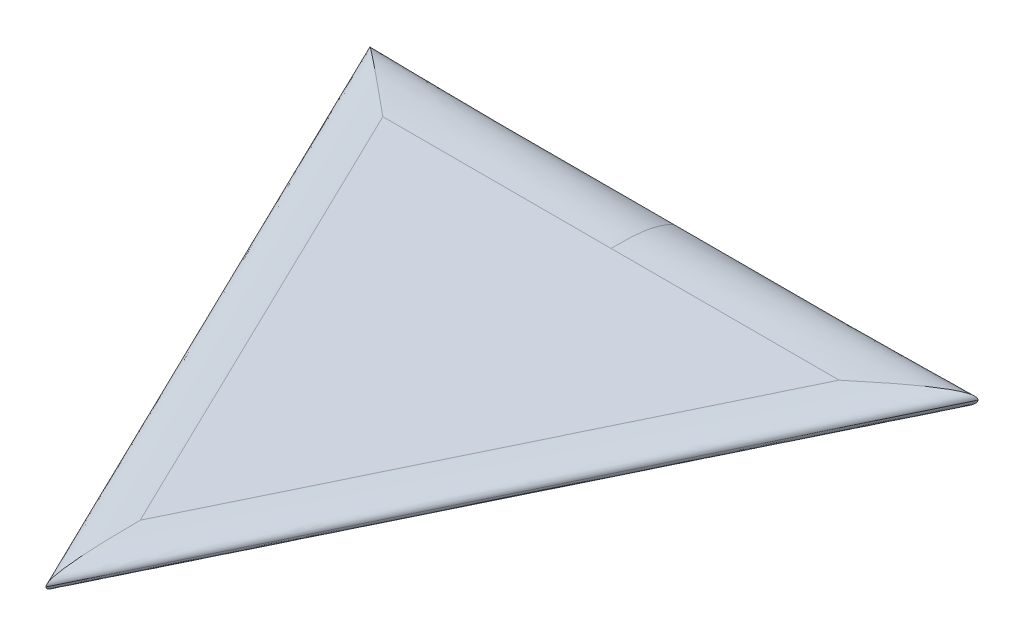
ISO-10303-21;
HEADER;
FILE_DESCRIPTION(('STEP AP214'),'2;1');
FILE_NAME('part.step','',(''),(''),'','','');
FILE_SCHEMA(('AUTOMOTIVE_DESIGN { 1 0 10303 214 1 1 1 1 }'));
ENDSEC;
DATA;
#1=APPLICATION_CONTEXT('core data for automotive mechanical design processes');
#2=APPLICATION_PROTOCOL_DEFINITION('international standard','automotive_design',2000,#1);
#3=PRODUCT_CONTEXT('',#1,'mechanical');
#4=PRODUCT('Part','Part','',(#3));
#5=PRODUCT_RELATED_PRODUCT_CATEGORY('part','',(#4));
#6=PRODUCT_DEFINITION_FORMATION('','',#4);
#7=PRODUCT_DEFINITION_CONTEXT('part definition',#1,'design');
#8=PRODUCT_DEFINITION('design','',#6,#7);
#9=PRODUCT_DEFINITION_SHAPE('','',#8);
#10=(LENGTH_UNIT() NAMED_UNIT(*) SI_UNIT(.MILLI.,.METRE.));
#11=(NAMED_UNIT(*) PLANE_ANGLE_UNIT() SI_UNIT($,.RADIAN.));
#12=(NAMED_UNIT(*) SI_UNIT($,.STERADIAN.) SOLID_ANGLE_UNIT());
#13=UNCERTAINTY_MEASURE_WITH_UNIT(LENGTH_MEASURE(1.E-05),#10,'distance_accuracy_value','');
#14=(GEOMETRIC_REPRESENTATION_CONTEXT(3) GLOBAL_UNCERTAINTY_ASSIGNED_CONTEXT((#13)) GLOBAL_UNIT_ASSIGNED_CONTEXT((#10,
#11,#12)) REPRESENTATION_CONTEXT('',''));
#15=CARTESIAN_POINT('',(0.,0.,0.));
#16=DIRECTION('',(0.,0.,1.));
#17=DIRECTION('',(1.,0.,0.));
#18=AXIS2_PLACEMENT_3D('',#15,#16,#17);
#19=CARTESIAN_POINT('',(0.,1.70008,0.));
#20=DIRECTION('',(0.,-1.,0.));
#21=DIRECTION('',(0.,0.,-1.));
#22=AXIS2_PLACEMENT_3D('',#19,#20,#21);
#23=PLANE('',#22);
#24=DIRECTION('',(1.,0.,0.));
#25=VECTOR('',#24,1.);
#26=CARTESIAN_POINT('',(18.1702141807132,1.70008,-90.));
#27=LINE('',#26,#25);
#28=CARTESIAN_POINT('',(0.,1.70008,-90.));
#29=VERTEX_POINT('',#28);
#30=CARTESIAN_POINT('',(36.3404283614264,1.70008,-90.));
#31=VERTEX_POINT('',#30);
#32=EDGE_CURVE('E122',#29,#31,#27,.T.);
#33=ORIENTED_EDGE('',*,*,#32,.F.);
#34=DIRECTION('',(-1.,0.,0.));
#35=VECTOR('',#34,1.);
#36=CARTESIAN_POINT('',(-18.1702141807132,1.70008,-90.));
#37=LINE('',#36,#35);
#38=CARTESIAN_POINT('',(-36.3404283614264,1.70008,-90.));
#39=VERTEX_POINT('',#38);
#40=EDGE_CURVE('E521',#29,#39,#37,.T.);
#41=ORIENTED_EDGE('',*,*,#40,.T.);
#42=DIRECTION('',(0.436048023411072,0.,0.899923397450748));
#43=VECTOR('',#42,1.);
#44=CARTESIAN_POINT('',(-18.1702141807132,1.70008,-52.5));
#45=LINE('',#44,#43);
#46=CARTESIAN_POINT('',(0.,1.70008,-15.));
#47=VERTEX_POINT('',#46);
#48=EDGE_CURVE('E134',#39,#47,#45,.T.);
#49=ORIENTED_EDGE('',*,*,#48,.T.);
#50=DIRECTION('',(-0.436048023411072,0.,0.899923397450748));
#51=VECTOR('',#50,1.);
#52=CARTESIAN_POINT('',(18.1702141807132,1.70008,-52.5));
#53=LINE('',#52,#51);
#54=EDGE_CURVE('E129',#31,#47,#53,.T.);
#55=ORIENTED_EDGE('',*,*,#54,.F.);
#56=EDGE_LOOP('',(#33,#41,#49,#55));
#57=FACE_BOUND('',#56,.T.);
#58=ADVANCED_FACE('F113',(#57),#23,.F.);
#59=CARTESIAN_POINT('',(0.,1.70008,-15.));
#60=CARTESIAN_POINT('',(12.1134761204755,1.70008,-40.));
#61=CARTESIAN_POINT('',(24.226952240951,1.70008,-65.));
#62=CARTESIAN_POINT('',(36.3404283614264,1.70008,-90.));
#63=CARTESIAN_POINT('',(0.,1.70008,-14.7483994170613));
#64=CARTESIAN_POINT('',(12.1778442477488,1.70008,-39.8862021542223));
#65=CARTESIAN_POINT('',(24.3630565973957,1.70008,-65.0241128715533));
#66=CARTESIAN_POINT('',(36.5434986665467,1.70008,-90.1676399929307));
#67=CARTESIAN_POINT('',(0.,1.70008,-9.71638775828661));
#68=CARTESIAN_POINT('',(13.4718507420828,1.70008,-37.6141334815913));
#69=CARTESIAN_POINT('',(27.0836954202283,1.70008,-65.5139308281273));
#70=CARTESIAN_POINT('',(40.6049047689522,1.70008,-93.5204398515447));
#71=CARTESIAN_POINT('',(0.,1.44840525822499,0.));
#72=CARTESIAN_POINT('',(16.1513014939673,1.52711668709418,-33.3333333333334));
#73=CARTESIAN_POINT('',(32.3026029879346,1.60582811596337,-66.6666666666667));
#74=CARTESIAN_POINT('',(48.4539044819019,1.68453954483256,-100.));
#75=CARTESIAN_POINT('',(0.,0.,0.));
#76=CARTESIAN_POINT('',(16.1513014939673,0.,-33.3333333333333));
#77=CARTESIAN_POINT('',(32.3026029879346,0.,-66.6666666666667));
#78=CARTESIAN_POINT('',(48.4539044819019,0.,-100.));
#79=B_SPLINE_SURFACE_WITH_KNOTS('',3,3,((#59,#60,#61,#62),(#63,#64,#65,#66),(#67,#68,#69,#70),
(#71,#72,#73,#74),(#75,#76,#77,#78)),.UNSPECIFIED.,.F.,.F.,.F.,(4,1,4),(4,4),(0.,
0.0500000000000003,1.),(0.,1.),.UNSPECIFIED.);
#80=CARTESIAN_POINT('',(0.,1.70008,-15.));
#81=CARTESIAN_POINT('',(0.,1.70008,-14.7483994170613));
#82=CARTESIAN_POINT('',(0.,1.70008,-9.71638775828661));
#83=CARTESIAN_POINT('',(0.,1.44840525822499,0.));
#84=CARTESIAN_POINT('',(0.,0.,0.));
#85=B_SPLINE_CURVE_WITH_KNOTS('',3,(#80,#81,#82,#83,#84),.UNSPECIFIED.,.F.,.F.,(4,1,4),(0.,
0.0500000000000003,1.),.UNSPECIFIED.);
#86=CARTESIAN_POINT('',(0.,0.,0.));
#87=VERTEX_POINT('',#86);
#88=EDGE_CURVE('E384',#47,#87,#85,.T.);
#89=DIRECTION('',(0.436048023411072,0.,-0.899923397450748));
#90=VECTOR('',#89,1.);
#91=CARTESIAN_POINT('',(0.,0.,0.));
#92=LINE('',#91,#90);
#93=CARTESIAN_POINT('',(48.4539044819019,0.,-100.));
#94=VERTEX_POINT('',#93);
#95=EDGE_CURVE('E342',#87,#94,#92,.T.);
#96=CARTESIAN_POINT('',(36.3404283614264,1.70008,-90.));
#97=CARTESIAN_POINT('',(37.3557798870278,1.70008,-90.8381999646535));
#98=CARTESIAN_POINT('',(39.7613131676455,1.70694788147637,-92.8240323192092));
#99=CARTESIAN_POINT('',(43.9713074780562,1.56901335403724,-96.2994957357709));
#100=CARTESIAN_POINT('',(47.4171355480387,1.09855531385303,-99.1441193893875));
#101=CARTESIAN_POINT('',(48.4539044819019,0.443299880219094,-100.));
#102=CARTESIAN_POINT('',(48.4539044819019,0.,-100.));
#103=B_SPLINE_CURVE_WITH_KNOTS('',3,(#96,#97,#98,#99,#100,#101,#102),.UNSPECIFIED.,.F.,.F.,(4,1,
1,1,4),(0.,0.25,0.5,0.75,1.),.UNSPECIFIED.);
#104=EDGE_CURVE('E13',#31,#94,#103,.T.);
#105=ORIENTED_EDGE('',*,*,#88,.T.);
#106=ORIENTED_EDGE('',*,*,#95,.T.);
#107=ORIENTED_EDGE('',*,*,#104,.F.);
#108=ORIENTED_EDGE('',*,*,#54,.T.);
#109=EDGE_LOOP('',(#105,#106,#107,#108));
#110=FACE_BOUND('',#109,.T.);
#111=ADVANCED_FACE('F308',(#110),#79,.T.);
#112=CARTESIAN_POINT('',(36.3404283614264,1.70008,-90.));
#113=CARTESIAN_POINT('',(24.2269522409509,1.70008,-90.));
#114=CARTESIAN_POINT('',(12.1134761204755,1.70008,-90.));
#115=CARTESIAN_POINT('',(0.,1.70008,-90.));
#116=CARTESIAN_POINT('',(37.3557798870278,1.70008,-90.8381999646535));
#117=CARTESIAN_POINT('',(24.9038532580185,1.70008,-90.8405634268338));
#118=CARTESIAN_POINT('',(12.4519266290093,1.70008,-90.8429268890141));
#119=CARTESIAN_POINT('',(0.,1.70008,-90.8452903511943));
#120=CARTESIAN_POINT('',(39.7613131676455,1.70694788147637,-92.8240323192092));
#121=CARTESIAN_POINT('',(26.5075421117637,1.70465858765091,-92.7279785640005));
#122=CARTESIAN_POINT('',(13.2537710558818,1.70236929382546,-92.6319248087918));
#123=CARTESIAN_POINT('',(0.,1.70008,-92.5358710535831));
#124=CARTESIAN_POINT('',(43.9713074780562,1.56901335403724,-96.2994957357709));
#125=CARTESIAN_POINT('',(29.3142049853708,1.55957473602482,-95.885760644538));
#126=CARTESIAN_POINT('',(14.6571024926854,1.55013611801241,-95.4720255533051));
#127=CARTESIAN_POINT('',(0.,1.5406975,-95.0582904620722));
#128=CARTESIAN_POINT('',(47.4171355480387,1.09855531385303,-99.1441193893875));
#129=CARTESIAN_POINT('',(31.6114236986925,1.08655354256869,-98.6140151197165));
#130=CARTESIAN_POINT('',(15.8057118493462,1.07455177128434,-98.0839108500455));
#131=CARTESIAN_POINT('',(0.,1.06255,-97.5538065803745));
#132=CARTESIAN_POINT('',(48.4539044819019,0.443299880219094,-100.));
#133=CARTESIAN_POINT('',(32.3026029879346,0.437206586812729,-99.7301935674629));
#134=CARTESIAN_POINT('',(16.1513014939673,0.431113293406364,-99.4603871349258));
#135=CARTESIAN_POINT('',(0.,0.42502,-99.1905807023886));
#136=CARTESIAN_POINT('',(48.4539044819019,0.,-100.));
#137=CARTESIAN_POINT('',(32.3026029879346,0.,-100.));
#138=CARTESIAN_POINT('',(16.1513014939673,0.,-100.));
#139=CARTESIAN_POINT('',(0.,0.,-100.));
#140=B_SPLINE_SURFACE_WITH_KNOTS('',3,3,((#112,#113,#114,#115),(#116,#117,#118,#119),(#120,#121,
#122,#123),(#124,#125,#126,#127),(#128,#129,#130,#131),(#132,#133,#134,#135),(#136,#137,#138,
#139)),.UNSPECIFIED.,.F.,.F.,.F.,(4,1,1,1,4),(4,4),(0.,0.25,0.5,0.75,1.),(0.,1.),.UNSPECIFIED.);
#141=DIRECTION('',(-1.,0.,0.));
#142=VECTOR('',#141,1.);
#143=CARTESIAN_POINT('',(48.4539044819019,0.,-100.));
#144=LINE('',#143,#142);
#145=CARTESIAN_POINT('',(0.,0.,-100.));
#146=VERTEX_POINT('',#145);
#147=EDGE_CURVE('E334',#94,#146,#144,.T.);
#148=CARTESIAN_POINT('',(0.,1.70008,-90.));
#149=CARTESIAN_POINT('',(0.,1.70008,-90.8452903511943));
#150=CARTESIAN_POINT('',(0.,1.70008,-92.5358710535831));
#151=CARTESIAN_POINT('',(0.,1.5406975,-95.0582904620722));
#152=CARTESIAN_POINT('',(0.,1.06255,-97.5538065803745));
#153=CARTESIAN_POINT('',(0.,0.42502,-99.1905807023886));
#154=CARTESIAN_POINT('',(0.,0.,-100.));
#155=B_SPLINE_CURVE_WITH_KNOTS('',3,(#148,#149,#150,#151,#152,#153,#154),.UNSPECIFIED.,.F.,.F.,
(4,1,1,1,4),(0.,0.25,0.5,0.75,1.),.UNSPECIFIED.);
#156=EDGE_CURVE('E190',#146,#29,#155,.F.);
#157=ORIENTED_EDGE('',*,*,#104,.T.);
#158=ORIENTED_EDGE('',*,*,#147,.T.);
#159=ORIENTED_EDGE('',*,*,#156,.T.);
#160=ORIENTED_EDGE('',*,*,#32,.T.);
#161=EDGE_LOOP('',(#157,#158,#159,#160));
#162=FACE_BOUND('',#161,.T.);
#163=ADVANCED_FACE('F297',(#162),#140,.T.);
#164=CARTESIAN_POINT('',(0.,-1.70008,0.));
#165=DIRECTION('',(0.,1.,0.));
#166=DIRECTION('',(0.,0.,-1.));
#167=AXIS2_PLACEMENT_3D('',#164,#165,#166);
#168=PLANE('',#167);
#169=DIRECTION('',(-0.436048023411072,0.,0.899923397450748));
#170=VECTOR('',#169,1.);
#171=CARTESIAN_POINT('',(18.1702141807132,-1.70008,-52.5));
#172=LINE('',#171,#170);
#173=CARTESIAN_POINT('',(36.3404283614264,-1.70008,-90.));
#174=VERTEX_POINT('',#173);
#175=CARTESIAN_POINT('',(0.,-1.70008,-15.));
#176=VERTEX_POINT('',#175);
#177=EDGE_CURVE('E205',#174,#176,#172,.T.);
#178=ORIENTED_EDGE('',*,*,#177,.T.);
#179=DIRECTION('',(0.436048023411072,0.,0.899923397450748));
#180=VECTOR('',#179,1.);
#181=CARTESIAN_POINT('',(-18.1702141807132,-1.70008,-52.5));
#182=LINE('',#181,#180);
#183=CARTESIAN_POINT('',(-36.3404283614264,-1.70008,-90.));
#184=VERTEX_POINT('',#183);
#185=EDGE_CURVE('E386',#184,#176,#182,.T.);
#186=ORIENTED_EDGE('',*,*,#185,.F.);
#187=DIRECTION('',(-1.,0.,0.));
#188=VECTOR('',#187,1.);
#189=CARTESIAN_POINT('',(-18.1702141807132,-1.70008,-90.));
#190=LINE('',#189,#188);
#191=CARTESIAN_POINT('',(0.,-1.70008,-90.));
#192=VERTEX_POINT('',#191);
#193=EDGE_CURVE('E174',#192,#184,#190,.T.);
#194=ORIENTED_EDGE('',*,*,#193,.F.);
#195=DIRECTION('',(1.,0.,0.));
#196=VECTOR('',#195,1.);
#197=CARTESIAN_POINT('',(18.1702141807132,-1.70008,-90.));
#198=LINE('',#197,#196);
#199=EDGE_CURVE('E258',#192,#174,#198,.T.);
#200=ORIENTED_EDGE('',*,*,#199,.T.);
#201=EDGE_LOOP('',(#178,#186,#194,#200));
#202=FACE_BOUND('',#201,.T.);
#203=ADVANCED_FACE('F307',(#202),#168,.F.);
#204=CARTESIAN_POINT('',(0.,-1.70008,-15.));
#205=CARTESIAN_POINT('',(12.1134761204755,-1.70008,-40.));
#206=CARTESIAN_POINT('',(24.226952240951,-1.70008,-65.));
#207=CARTESIAN_POINT('',(36.3404283614264,-1.70008,-90.));
#208=CARTESIAN_POINT('',(0.,-1.70008,-14.7483994170613));
#209=CARTESIAN_POINT('',(12.1778442477488,-1.70008,-39.8862021542223));
#210=CARTESIAN_POINT('',(24.3630565973957,-1.70008,-65.0241128715533));
#211=CARTESIAN_POINT('',(36.5434986665467,-1.70008,-90.1676399929307));
#212=CARTESIAN_POINT('',(0.,-1.70008,-9.71638775828661));
#213=CARTESIAN_POINT('',(13.4718507420828,-1.70008,-37.6141334815913));
#214=CARTESIAN_POINT('',(27.0836954202283,-1.70008,-65.5139308281273));
#215=CARTESIAN_POINT('',(40.6049047689522,-1.70008,-93.5204398515447));
#216=CARTESIAN_POINT('',(0.,-1.44840525822499,0.));
#217=CARTESIAN_POINT('',(16.1513014939673,-1.52711668709418,-33.3333333333334));
#218=CARTESIAN_POINT('',(32.3026029879346,-1.60582811596337,-66.6666666666667));
#219=CARTESIAN_POINT('',(48.4539044819019,-1.68453954483256,-100.));
#220=CARTESIAN_POINT('',(0.,0.,0.));
#221=CARTESIAN_POINT('',(16.1513014939673,0.,-33.3333333333333));
#222=CARTESIAN_POINT('',(32.3026029879346,0.,-66.6666666666667));
#223=CARTESIAN_POINT('',(48.4539044819019,0.,-100.));
#224=B_SPLINE_SURFACE_WITH_KNOTS('',3,3,((#204,#205,#206,#207),(#208,#209,#210,#211),(#212,#213,
#214,#215),(#216,#217,#218,#219),(#220,#221,#222,#223)),.UNSPECIFIED.,.F.,.F.,.F.,(4,1,4),(4,4),
(0.,0.0500000000000003,1.),(0.,1.),.UNSPECIFIED.);
#225=CARTESIAN_POINT('',(0.,-1.70008,-15.));
#226=CARTESIAN_POINT('',(0.,-1.70008,-14.7483994170613));
#227=CARTESIAN_POINT('',(0.,-1.70008,-9.71638775828661));
#228=CARTESIAN_POINT('',(0.,-1.44840525822499,0.));
#229=CARTESIAN_POINT('',(0.,0.,0.));
#230=B_SPLINE_CURVE_WITH_KNOTS('',3,(#225,#226,#227,#228,#229),.UNSPECIFIED.,.F.,.F.,(4,1,4),
(0.,0.0500000000000003,1.),.UNSPECIFIED.);
#231=EDGE_CURVE('E197',#176,#87,#230,.T.);
#232=CARTESIAN_POINT('',(36.3404283614264,-1.70008,-90.));
#233=CARTESIAN_POINT('',(36.5434986665467,-1.70008,-90.1676399929307));
#234=CARTESIAN_POINT('',(40.6049047689522,-1.70008,-93.5204398515447));
#235=CARTESIAN_POINT('',(48.4539044819019,-1.68453954483256,-100.));
#236=CARTESIAN_POINT('',(48.4539044819019,0.,-100.));
#237=B_SPLINE_CURVE_WITH_KNOTS('',3,(#232,#233,#234,#235,#236),.UNSPECIFIED.,.F.,.F.,(4,1,4),
(0.,0.0500000000000003,1.),.UNSPECIFIED.);
#238=EDGE_CURVE('E267',#174,#94,#237,.T.);
#239=ORIENTED_EDGE('',*,*,#231,.F.);
#240=ORIENTED_EDGE('',*,*,#177,.F.);
#241=ORIENTED_EDGE('',*,*,#238,.T.);
#242=ORIENTED_EDGE('',*,*,#95,.F.);
#243=EDGE_LOOP('',(#239,#240,#241,#242));
#244=FACE_BOUND('',#243,.T.);
#245=ADVANCED_FACE('F241',(#244),#224,.F.);
#246=CARTESIAN_POINT('',(36.3404283614264,-1.70008,-90.));
#247=CARTESIAN_POINT('',(24.2269522409509,-1.70008,-90.));
#248=CARTESIAN_POINT('',(12.1134761204755,-1.70008,-90.));
#249=CARTESIAN_POINT('',(0.,-1.70008,-90.));
#250=CARTESIAN_POINT('',(37.3557798870278,-1.70008,-90.8381999646535));
#251=CARTESIAN_POINT('',(24.9038532580185,-1.70008,-90.8405634268338));
#252=CARTESIAN_POINT('',(12.4519266290093,-1.70008,-90.8429268890141));
#253=CARTESIAN_POINT('',(0.,-1.70008,-90.8452903511943));
#254=CARTESIAN_POINT('',(39.7613131676455,-1.70694788147637,-92.8240323192092));
#255=CARTESIAN_POINT('',(26.5075421117637,-1.70465858765091,-92.7279785640005));
#256=CARTESIAN_POINT('',(13.2537710558818,-1.70236929382546,-92.6319248087918));
#257=CARTESIAN_POINT('',(0.,-1.70008,-92.5358710535831));
#258=CARTESIAN_POINT('',(43.9713074780562,-1.56901335403724,-96.2994957357709));
#259=CARTESIAN_POINT('',(29.3142049853708,-1.55957473602482,-95.885760644538));
#260=CARTESIAN_POINT('',(14.6571024926854,-1.55013611801241,-95.4720255533051));
#261=CARTESIAN_POINT('',(0.,-1.5406975,-95.0582904620722));
#262=CARTESIAN_POINT('',(47.4171355480387,-1.09855531385303,-99.1441193893875));
#263=CARTESIAN_POINT('',(31.6114236986925,-1.08655354256869,-98.6140151197165));
#264=CARTESIAN_POINT('',(15.8057118493462,-1.07455177128434,-98.0839108500455));
#265=CARTESIAN_POINT('',(0.,-1.06255,-97.5538065803745));
#266=CARTESIAN_POINT('',(48.4539044819019,-0.443299880219094,-100.));
#267=CARTESIAN_POINT('',(32.3026029879346,-0.437206586812729,-99.7301935674629));
#268=CARTESIAN_POINT('',(16.1513014939673,-0.431113293406364,-99.4603871349258));
#269=CARTESIAN_POINT('',(0.,-0.42502,-99.1905807023886));
#270=CARTESIAN_POINT('',(48.4539044819019,0.,-100.));
#271=CARTESIAN_POINT('',(32.3026029879346,0.,-100.));
#272=CARTESIAN_POINT('',(16.1513014939673,0.,-100.));
#273=CARTESIAN_POINT('',(0.,0.,-100.));
#274=B_SPLINE_SURFACE_WITH_KNOTS('',3,3,((#246,#247,#248,#249),(#250,#251,#252,#253),(#254,#255,
#256,#257),(#258,#259,#260,#261),(#262,#263,#264,#265),(#266,#267,#268,#269),(#270,#271,#272,
#273)),.UNSPECIFIED.,.F.,.F.,.F.,(4,1,1,1,4),(4,4),(0.,0.25,0.5,0.75,1.),(0.,1.),.UNSPECIFIED.);
#275=CARTESIAN_POINT('',(0.,-1.70008,-90.));
#276=CARTESIAN_POINT('',(0.,-1.70008,-90.8452903511943));
#277=CARTESIAN_POINT('',(0.,-1.70008,-92.5358710535831));
#278=CARTESIAN_POINT('',(0.,-1.5406975,-95.0582904620722));
#279=CARTESIAN_POINT('',(0.,-1.06255,-97.5538065803745));
#280=CARTESIAN_POINT('',(0.,-0.42502,-99.1905807023886));
#281=CARTESIAN_POINT('',(0.,0.,-100.));
#282=B_SPLINE_CURVE_WITH_KNOTS('',3,(#275,#276,#277,#278,#279,#280,#281),.UNSPECIFIED.,.F.,.F.,
(4,1,1,1,4),(0.,0.25,0.5,0.75,1.),.UNSPECIFIED.);
#283=EDGE_CURVE('E181',#146,#192,#282,.F.);
#284=ORIENTED_EDGE('',*,*,#238,.F.);
#285=ORIENTED_EDGE('',*,*,#199,.F.);
#286=ORIENTED_EDGE('',*,*,#283,.F.);
#287=ORIENTED_EDGE('',*,*,#147,.F.);
#288=EDGE_LOOP('',(#284,#285,#286,#287));
#289=FACE_BOUND('',#288,.T.);
#290=ADVANCED_FACE('F226',(#289),#274,.F.);
#291=CARTESIAN_POINT('',(0.,1.70008,-15.));
#292=CARTESIAN_POINT('',(-12.1134761204755,1.70008,-40.));
#293=CARTESIAN_POINT('',(-24.226952240951,1.70008,-65.));
#294=CARTESIAN_POINT('',(-36.3404283614264,1.70008,-90.));
#295=CARTESIAN_POINT('',(0.,1.70008,-14.7483994170613));
#296=CARTESIAN_POINT('',(-12.1778442477488,1.70008,-39.8862021542223));
#297=CARTESIAN_POINT('',(-24.3630565973957,1.70008,-65.0241128715533));
#298=CARTESIAN_POINT('',(-36.5434986665467,1.70008,-90.1676399929307));
#299=CARTESIAN_POINT('',(0.,1.70008,-9.71638775828661));
#300=CARTESIAN_POINT('',(-13.4718507420828,1.70008,-37.6141334815913));
#301=CARTESIAN_POINT('',(-27.0836954202283,1.70008,-65.5139308281273));
#302=CARTESIAN_POINT('',(-40.6049047689522,1.70008,-93.5204398515447));
#303=CARTESIAN_POINT('',(0.,1.44840525822499,0.));
#304=CARTESIAN_POINT('',(-16.1513014939673,1.52711668709418,-33.3333333333334));
#305=CARTESIAN_POINT('',(-32.3026029879346,1.60582811596337,-66.6666666666667));
#306=CARTESIAN_POINT('',(-48.4539044819019,1.68453954483256,-100.));
#307=CARTESIAN_POINT('',(0.,0.,0.));
#308=CARTESIAN_POINT('',(-16.1513014939673,0.,-33.3333333333333));
#309=CARTESIAN_POINT('',(-32.3026029879346,0.,-66.6666666666667));
#310=CARTESIAN_POINT('',(-48.4539044819019,0.,-100.));
#311=B_SPLINE_SURFACE_WITH_KNOTS('',3,3,((#291,#292,#293,#294),(#295,#296,#297,#298),(#299,#300,
#301,#302),(#303,#304,#305,#306),(#307,#308,#309,#310)),.UNSPECIFIED.,.F.,.F.,.F.,(4,1,4),(4,4),
(0.,0.0500000000000003,1.),(0.,1.),.UNSPECIFIED.);
#312=CARTESIAN_POINT('',(-36.3404283614264,1.70008,-90.));
#313=CARTESIAN_POINT('',(-36.5434986665467,1.70008,-90.1676399929307));
#314=CARTESIAN_POINT('',(-40.6049047689522,1.70008,-93.5204398515447));
#315=CARTESIAN_POINT('',(-48.4539044819019,1.68453954483256,-100.));
#316=CARTESIAN_POINT('',(-48.4539044819019,0.,-100.));
#317=B_SPLINE_CURVE_WITH_KNOTS('',3,(#312,#313,#314,#315,#316),.UNSPECIFIED.,.F.,.F.,(4,1,4),
(0.,0.0500000000000003,1.),.UNSPECIFIED.);
#318=CARTESIAN_POINT('',(-48.4539044819019,0.,-100.));
#319=VERTEX_POINT('',#318);
#320=EDGE_CURVE('E187',#39,#319,#317,.T.);
#321=DIRECTION('',(-0.436048023411072,0.,-0.899923397450748));
#322=VECTOR('',#321,1.);
#323=CARTESIAN_POINT('',(0.,0.,0.));
#324=LINE('',#323,#322);
#325=EDGE_CURVE('E180',#87,#319,#324,.T.);
#326=ORIENTED_EDGE('',*,*,#88,.F.);
#327=ORIENTED_EDGE('',*,*,#48,.F.);
#328=ORIENTED_EDGE('',*,*,#320,.T.);
#329=ORIENTED_EDGE('',*,*,#325,.F.);
#330=EDGE_LOOP('',(#326,#327,#328,#329));
#331=FACE_BOUND('',#330,.T.);
#332=ADVANCED_FACE('F203',(#331),#311,.F.);
#333=CARTESIAN_POINT('',(-36.3404283614264,1.70008,-90.));
#334=CARTESIAN_POINT('',(-24.2269522409509,1.70008,-90.));
#335=CARTESIAN_POINT('',(-12.1134761204755,1.70008,-90.));
#336=CARTESIAN_POINT('',(0.,1.70008,-90.));
#337=CARTESIAN_POINT('',(-37.3557798870278,1.70008,-90.8381999646535));
#338=CARTESIAN_POINT('',(-24.9038532580185,1.70008,-90.8405634268338));
#339=CARTESIAN_POINT('',(-12.4519266290093,1.70008,-90.8429268890141));
#340=CARTESIAN_POINT('',(0.,1.70008,-90.8452903511943));
#341=CARTESIAN_POINT('',(-39.7613131676455,1.70694788147637,-92.8240323192092));
#342=CARTESIAN_POINT('',(-26.5075421117637,1.70465858765091,-92.7279785640005));
#343=CARTESIAN_POINT('',(-13.2537710558818,1.70236929382546,-92.6319248087918));
#344=CARTESIAN_POINT('',(0.,1.70008,-92.5358710535831));
#345=CARTESIAN_POINT('',(-43.9713074780562,1.56901335403724,-96.2994957357709));
#346=CARTESIAN_POINT('',(-29.3142049853708,1.55957473602482,-95.885760644538));
#347=CARTESIAN_POINT('',(-14.6571024926854,1.55013611801241,-95.4720255533051));
#348=CARTESIAN_POINT('',(0.,1.5406975,-95.0582904620722));
#349=CARTESIAN_POINT('',(-47.4171355480387,1.09855531385303,-99.1441193893875));
#350=CARTESIAN_POINT('',(-31.6114236986925,1.08655354256869,-98.6140151197165));
#351=CARTESIAN_POINT('',(-15.8057118493462,1.07455177128434,-98.0839108500455));
#352=CARTESIAN_POINT('',(0.,1.06255,-97.5538065803745));
#353=CARTESIAN_POINT('',(-48.4539044819019,0.443299880219094,-100.));
#354=CARTESIAN_POINT('',(-32.3026029879346,0.437206586812729,-99.7301935674629));
#355=CARTESIAN_POINT('',(-16.1513014939673,0.431113293406364,-99.4603871349258));
#356=CARTESIAN_POINT('',(0.,0.42502,-99.1905807023886));
#357=CARTESIAN_POINT('',(-48.4539044819019,0.,-100.));
#358=CARTESIAN_POINT('',(-32.3026029879346,0.,-100.));
#359=CARTESIAN_POINT('',(-16.1513014939673,0.,-100.));
#360=CARTESIAN_POINT('',(0.,0.,-100.));
#361=B_SPLINE_SURFACE_WITH_KNOTS('',3,3,((#333,#334,#335,#336),(#337,#338,#339,#340),(#341,#342,
#343,#344),(#345,#346,#347,#348),(#349,#350,#351,#352),(#353,#354,#355,#356),(#357,#358,#359,
#360)),.UNSPECIFIED.,.F.,.F.,.F.,(4,1,1,1,4),(4,4),(0.,0.25,0.5,0.75,1.),(0.,1.),.UNSPECIFIED.);
#362=DIRECTION('',(1.,0.,0.));
#363=VECTOR('',#362,1.);
#364=CARTESIAN_POINT('',(-48.4539044819019,0.,-100.));
#365=LINE('',#364,#363);
#366=EDGE_CURVE('E172',#319,#146,#365,.T.);
#367=ORIENTED_EDGE('',*,*,#320,.F.);
#368=ORIENTED_EDGE('',*,*,#40,.F.);
#369=ORIENTED_EDGE('',*,*,#156,.F.);
#370=ORIENTED_EDGE('',*,*,#366,.F.);
#371=EDGE_LOOP('',(#367,#368,#369,#370));
#372=FACE_BOUND('',#371,.T.);
#373=ADVANCED_FACE('F185',(#372),#361,.F.);
#374=CARTESIAN_POINT('',(0.,-1.70008,-15.));
#375=CARTESIAN_POINT('',(-12.1134761204755,-1.70008,-40.));
#376=CARTESIAN_POINT('',(-24.226952240951,-1.70008,-65.));
#377=CARTESIAN_POINT('',(-36.3404283614264,-1.70008,-90.));
#378=CARTESIAN_POINT('',(0.,-1.70008,-14.7483994170613));
#379=CARTESIAN_POINT('',(-12.1778442477488,-1.70008,-39.8862021542223));
#380=CARTESIAN_POINT('',(-24.3630565973957,-1.70008,-65.0241128715533));
#381=CARTESIAN_POINT('',(-36.5434986665467,-1.70008,-90.1676399929307));
#382=CARTESIAN_POINT('',(0.,-1.70008,-9.71638775828661));
#383=CARTESIAN_POINT('',(-13.4718507420828,-1.70008,-37.6141334815913));
#384=CARTESIAN_POINT('',(-27.0836954202283,-1.70008,-65.5139308281273));
#385=CARTESIAN_POINT('',(-40.6049047689522,-1.70008,-93.5204398515447));
#386=CARTESIAN_POINT('',(0.,-1.44840525822499,0.));
#387=CARTESIAN_POINT('',(-16.1513014939673,-1.52711668709418,-33.3333333333334));
#388=CARTESIAN_POINT('',(-32.3026029879346,-1.60582811596337,-66.6666666666667));
#389=CARTESIAN_POINT('',(-48.4539044819019,-1.68453954483256,-100.));
#390=CARTESIAN_POINT('',(0.,0.,0.));
#391=CARTESIAN_POINT('',(-16.1513014939673,0.,-33.3333333333333));
#392=CARTESIAN_POINT('',(-32.3026029879346,0.,-66.6666666666667));
#393=CARTESIAN_POINT('',(-48.4539044819019,0.,-100.));
#394=B_SPLINE_SURFACE_WITH_KNOTS('',3,3,((#374,#375,#376,#377),(#378,#379,#380,#381),(#382,#383,
#384,#385),(#386,#387,#388,#389),(#390,#391,#392,#393)),.UNSPECIFIED.,.F.,.F.,.F.,(4,1,4),(4,4),
(0.,0.0500000000000003,1.),(0.,1.),.UNSPECIFIED.);
#395=CARTESIAN_POINT('',(-36.3404283614264,-1.70008,-90.));
#396=CARTESIAN_POINT('',(-37.3557798870278,-1.70008,-90.8381999646535));
#397=CARTESIAN_POINT('',(-39.7613131676455,-1.70694788147637,-92.8240323192092));
#398=CARTESIAN_POINT('',(-43.9713074780562,-1.56901335403724,-96.2994957357709));
#399=CARTESIAN_POINT('',(-47.4171355480387,-1.09855531385303,-99.1441193893875));
#400=CARTESIAN_POINT('',(-48.4539044819019,-0.443299880219094,-100.));
#401=CARTESIAN_POINT('',(-48.4539044819019,0.,-100.));
#402=B_SPLINE_CURVE_WITH_KNOTS('',3,(#395,#396,#397,#398,#399,#400,#401),.UNSPECIFIED.,.F.,.F.,
(4,1,1,1,4),(0.,0.25,0.5,0.75,1.),.UNSPECIFIED.);
#403=EDGE_CURVE('E167',#184,#319,#402,.T.);
#404=ORIENTED_EDGE('',*,*,#231,.T.);
#405=ORIENTED_EDGE('',*,*,#325,.T.);
#406=ORIENTED_EDGE('',*,*,#403,.F.);
#407=ORIENTED_EDGE('',*,*,#185,.T.);
#408=EDGE_LOOP('',(#404,#405,#406,#407));
#409=FACE_BOUND('',#408,.T.);
#410=ADVANCED_FACE('F195',(#409),#394,.T.);
#411=CARTESIAN_POINT('',(-36.3404283614264,-1.70008,-90.));
#412=CARTESIAN_POINT('',(-24.2269522409509,-1.70008,-90.));
#413=CARTESIAN_POINT('',(-12.1134761204755,-1.70008,-90.));
#414=CARTESIAN_POINT('',(0.,-1.70008,-90.));
#415=CARTESIAN_POINT('',(-37.3557798870278,-1.70008,-90.8381999646535));
#416=CARTESIAN_POINT('',(-24.9038532580185,-1.70008,-90.8405634268338));
#417=CARTESIAN_POINT('',(-12.4519266290093,-1.70008,-90.8429268890141));
#418=CARTESIAN_POINT('',(0.,-1.70008,-90.8452903511943));
#419=CARTESIAN_POINT('',(-39.7613131676455,-1.70694788147637,-92.8240323192092));
#420=CARTESIAN_POINT('',(-26.5075421117637,-1.70465858765091,-92.7279785640005));
#421=CARTESIAN_POINT('',(-13.2537710558818,-1.70236929382546,-92.6319248087918));
#422=CARTESIAN_POINT('',(0.,-1.70008,-92.5358710535831));
#423=CARTESIAN_POINT('',(-43.9713074780562,-1.56901335403724,-96.2994957357709));
#424=CARTESIAN_POINT('',(-29.3142049853708,-1.55957473602482,-95.885760644538));
#425=CARTESIAN_POINT('',(-14.6571024926854,-1.55013611801241,-95.4720255533051));
#426=CARTESIAN_POINT('',(0.,-1.5406975,-95.0582904620722));
#427=CARTESIAN_POINT('',(-47.4171355480387,-1.09855531385303,-99.1441193893875));
#428=CARTESIAN_POINT('',(-31.6114236986925,-1.08655354256869,-98.6140151197165));
#429=CARTESIAN_POINT('',(-15.8057118493462,-1.07455177128434,-98.0839108500455));
#430=CARTESIAN_POINT('',(0.,-1.06255,-97.5538065803745));
#431=CARTESIAN_POINT('',(-48.4539044819019,-0.443299880219094,-100.));
#432=CARTESIAN_POINT('',(-32.3026029879346,-0.437206586812729,-99.7301935674629));
#433=CARTESIAN_POINT('',(-16.1513014939673,-0.431113293406364,-99.4603871349258));
#434=CARTESIAN_POINT('',(0.,-0.42502,-99.1905807023886));
#435=CARTESIAN_POINT('',(-48.4539044819019,0.,-100.));
#436=CARTESIAN_POINT('',(-32.3026029879346,0.,-100.));
#437=CARTESIAN_POINT('',(-16.1513014939673,0.,-100.));
#438=CARTESIAN_POINT('',(0.,0.,-100.));
#439=B_SPLINE_SURFACE_WITH_KNOTS('',3,3,((#411,#412,#413,#414),(#415,#416,#417,#418),(#419,#420,
#421,#422),(#423,#424,#425,#426),(#427,#428,#429,#430),(#431,#432,#433,#434),(#435,#436,#437,
#438)),.UNSPECIFIED.,.F.,.F.,.F.,(4,1,1,1,4),(4,4),(0.,0.25,0.5,0.75,1.),(0.,1.),.UNSPECIFIED.);
#440=ORIENTED_EDGE('',*,*,#403,.T.);
#441=ORIENTED_EDGE('',*,*,#366,.T.);
#442=ORIENTED_EDGE('',*,*,#283,.T.);
#443=ORIENTED_EDGE('',*,*,#193,.T.);
#444=EDGE_LOOP('',(#440,#441,#442,#443));
#445=FACE_BOUND('',#444,.T.);
#446=ADVANCED_FACE('F170',(#445),#439,.T.);
#447=CLOSED_SHELL('',(#58,#111,#163,#203,#245,#290,#332,#373,#410,#446));
#448=MANIFOLD_SOLID_BREP('B2',#447);
#449=ADVANCED_BREP_SHAPE_REPRESENTATION('',(#18,#448),#14);
#450=SHAPE_DEFINITION_REPRESENTATION(#9,#449);
ENDSEC;
END-ISO-10303-21;
